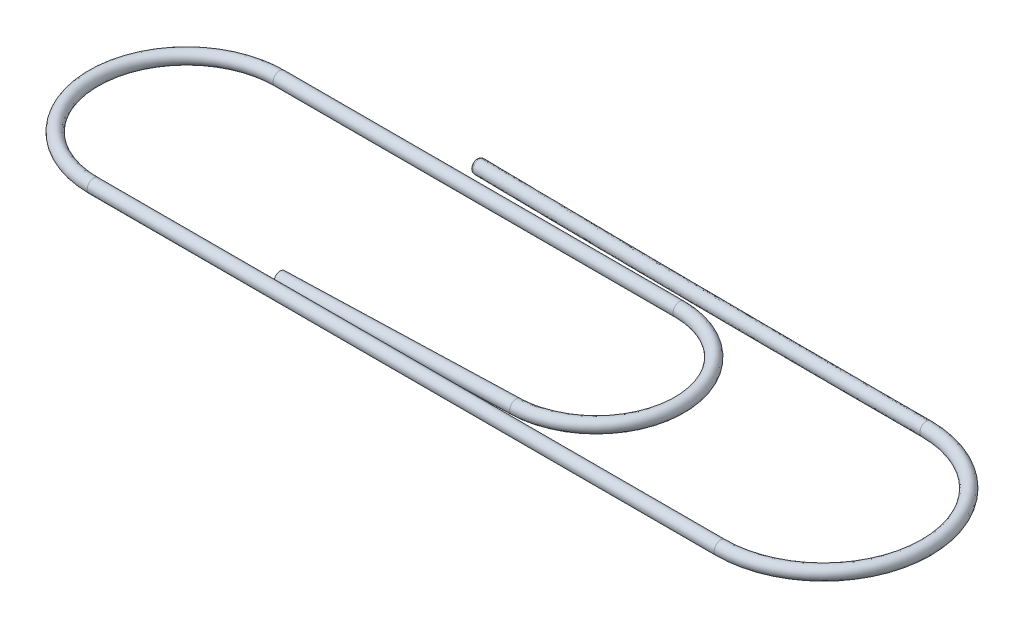
ISO-10303-21;
HEADER;
FILE_DESCRIPTION(('STEP AP214'),'2;1');
FILE_NAME('part.step','',(''),(''),'','','');
FILE_SCHEMA(('AUTOMOTIVE_DESIGN { 1 0 10303 214 1 1 1 1 }'));
ENDSEC;
DATA;
#1=APPLICATION_CONTEXT('core data for automotive mechanical design processes');
#2=APPLICATION_PROTOCOL_DEFINITION('international standard','automotive_design',2000,#1);
#3=PRODUCT_CONTEXT('',#1,'mechanical');
#4=PRODUCT('Part','Part','',(#3));
#5=PRODUCT_RELATED_PRODUCT_CATEGORY('part','',(#4));
#6=PRODUCT_DEFINITION_FORMATION('','',#4);
#7=PRODUCT_DEFINITION_CONTEXT('part definition',#1,'design');
#8=PRODUCT_DEFINITION('design','',#6,#7);
#9=PRODUCT_DEFINITION_SHAPE('','',#8);
#10=(LENGTH_UNIT() NAMED_UNIT(*) SI_UNIT(.MILLI.,.METRE.));
#11=(NAMED_UNIT(*) PLANE_ANGLE_UNIT() SI_UNIT($,.RADIAN.));
#12=(NAMED_UNIT(*) SI_UNIT($,.STERADIAN.) SOLID_ANGLE_UNIT());
#13=UNCERTAINTY_MEASURE_WITH_UNIT(LENGTH_MEASURE(1.E-05),#10,'distance_accuracy_value','');
#14=(GEOMETRIC_REPRESENTATION_CONTEXT(3) GLOBAL_UNCERTAINTY_ASSIGNED_CONTEXT((#13)) GLOBAL_UNIT_ASSIGNED_CONTEXT((#10,
#11,#12)) REPRESENTATION_CONTEXT('',''));
#15=CARTESIAN_POINT('',(0.,0.,0.));
#16=DIRECTION('',(0.,0.,1.));
#17=DIRECTION('',(1.,0.,0.));
#18=AXIS2_PLACEMENT_3D('',#15,#16,#17);
#19=CARTESIAN_POINT('',(19.1188837779093,0.,7.17392053449084));
#20=DIRECTION('',(-0.998871822194338,0.,0.0474877123702843));
#21=DIRECTION('',(0.0474877123702843,0.,0.998871822194338));
#22=AXIS2_PLACEMENT_3D('',#19,#20,#21);
#23=CIRCLE('',#22,0.25);
#24=DIRECTION('',(-0.999507468153765,0.,0.0313818594868043));
#25=VECTOR('',#24,1.);
#26=SURFACE_OF_LINEAR_EXTRUSION('',#23,#25);
#27=CARTESIAN_POINT('',(19.1307557060018,0.,7.42363849003943));
#28=VERTEX_POINT('',#27);
#29=EDGE_CURVE('E101',#28,#28,#23,.T.);
#30=ORIENTED_EDGE('',*,*,#29,.T.);
#31=EDGE_LOOP('',(#30));
#32=FACE_BOUND('',#31,.T.);
#33=CARTESIAN_POINT('',(10.2927008856981,0.,7.45103905551584));
#34=DIRECTION('',(-0.998871822194338,0.,0.0474877123702843));
#35=DIRECTION('',(0.0474877123702843,0.,0.998871822194338));
#36=AXIS2_PLACEMENT_3D('',#33,#34,#35);
#37=CIRCLE('',#36,0.25);
#38=CARTESIAN_POINT('',(10.3045728137906,0.,7.70075701106442));
#39=VERTEX_POINT('',#38);
#40=EDGE_CURVE('E63',#39,#39,#37,.T.);
#41=ORIENTED_EDGE('',*,*,#40,.F.);
#42=EDGE_LOOP('',(#41));
#43=FACE_BOUND('',#42,.T.);
#44=ADVANCED_FACE('F49',(#32,#43),#26,.T.);
#45=CARTESIAN_POINT('',(19.01825,0.,0.761999960988757));
#46=DIRECTION('',(0.999870098728555,0.,-0.0161178679902065));
#47=DIRECTION('',(-0.0161178679902065,0.,-0.999870098728555));
#48=AXIS2_PLACEMENT_3D('',#45,#46,#47);
#49=CIRCLE('',#48,0.25);
#50=CARTESIAN_POINT('',(19.01825,0.,3.96874996098875));
#51=DIRECTION('',(0.,-1.,0.));
#52=AXIS1_PLACEMENT('',#50,#51);
#53=SURFACE_OF_REVOLUTION('',#49,#52);
#54=CARTESIAN_POINT('',(19.0142205330025,0.,0.512032436306618));
#55=VERTEX_POINT('',#54);
#56=EDGE_CURVE('E104',#55,#55,#49,.T.);
#57=ORIENTED_EDGE('',*,*,#56,.T.);
#58=EDGE_LOOP('',(#57));
#59=FACE_BOUND('',#58,.T.);
#60=ORIENTED_EDGE('',*,*,#29,.F.);
#61=EDGE_LOOP('',(#60));
#62=FACE_BOUND('',#61,.T.);
#63=ADVANCED_FACE('F97',(#59,#62),#53,.F.);
#64=CARTESIAN_POINT('',(3.58775000000004,0.,0.761999960988757));
#65=DIRECTION('',(0.999870098728555,0.,-0.0161178679902065));
#66=DIRECTION('',(-0.0161178679902065,0.,-0.999870098728555));
#67=AXIS2_PLACEMENT_3D('',#64,#65,#66);
#68=CIRCLE('',#67,0.25);
#69=DIRECTION('',(1.,0.,0.));
#70=VECTOR('',#69,1.);
#71=SURFACE_OF_LINEAR_EXTRUSION('',#68,#70);
#72=CARTESIAN_POINT('',(3.58372053300249,0.,0.512032436306618));
#73=VERTEX_POINT('',#72);
#74=EDGE_CURVE('E133',#73,#73,#68,.T.);
#75=ORIENTED_EDGE('',*,*,#74,.T.);
#76=EDGE_LOOP('',(#75));
#77=FACE_BOUND('',#76,.T.);
#78=ORIENTED_EDGE('',*,*,#56,.F.);
#79=EDGE_LOOP('',(#78));
#80=FACE_BOUND('',#79,.T.);
#81=ADVANCED_FACE('F137',(#77,#80),#71,.T.);
#82=CARTESIAN_POINT('',(3.58775,0.,7.9375));
#83=DIRECTION('',(-0.999870098728555,0.,0.0161178679902206));
#84=DIRECTION('',(0.0161178679902206,0.,0.999870098728555));
#85=AXIS2_PLACEMENT_3D('',#82,#83,#84);
#86=CIRCLE('',#85,0.25);
#87=CARTESIAN_POINT('',(3.58775,0.,4.34974998049438));
#88=DIRECTION('',(0.,-1.,0.));
#89=AXIS1_PLACEMENT('',#87,#88);
#90=SURFACE_OF_REVOLUTION('',#86,#89);
#91=CARTESIAN_POINT('',(3.59177946699756,0.,8.18746752468213));
#92=VERTEX_POINT('',#91);
#93=EDGE_CURVE('E130',#92,#92,#86,.T.);
#94=ORIENTED_EDGE('',*,*,#93,.T.);
#95=EDGE_LOOP('',(#94));
#96=FACE_BOUND('',#95,.T.);
#97=ORIENTED_EDGE('',*,*,#74,.F.);
#98=EDGE_LOOP('',(#97));
#99=FACE_BOUND('',#98,.T.);
#100=ADVANCED_FACE('F135',(#96,#99),#90,.F.);
#101=CARTESIAN_POINT('',(27.78125,0.,7.9375));
#102=DIRECTION('',(-0.999870098728555,0.,0.0161178679902206));
#103=DIRECTION('',(0.0161178679902206,0.,0.999870098728555));
#104=AXIS2_PLACEMENT_3D('',#101,#102,#103);
#105=CIRCLE('',#104,0.25);
#106=DIRECTION('',(-1.,0.,0.));
#107=VECTOR('',#106,1.);
#108=SURFACE_OF_LINEAR_EXTRUSION('',#105,#107);
#109=CARTESIAN_POINT('',(27.7852794669976,0.,8.18746752468213));
#110=VERTEX_POINT('',#109);
#111=EDGE_CURVE('E126',#110,#110,#105,.T.);
#112=ORIENTED_EDGE('',*,*,#111,.T.);
#113=EDGE_LOOP('',(#112));
#114=FACE_BOUND('',#113,.T.);
#115=ORIENTED_EDGE('',*,*,#93,.F.);
#116=EDGE_LOOP('',(#115));
#117=FACE_BOUND('',#116,.T.);
#118=ADVANCED_FACE('F116',(#114,#117),#108,.T.);
#119=CARTESIAN_POINT('',(27.78125,0.,0.));
#120=DIRECTION('',(0.999870098728555,0.,-0.0161178679902205));
#121=DIRECTION('',(-0.0161178679902205,0.,-0.999870098728555));
#122=AXIS2_PLACEMENT_3D('',#119,#120,#121);
#123=CIRCLE('',#122,0.25);
#124=CARTESIAN_POINT('',(27.78125,0.,3.96875));
#125=DIRECTION('',(0.,-1.,0.));
#126=AXIS1_PLACEMENT('',#124,#125);
#127=SURFACE_OF_REVOLUTION('',#123,#126);
#128=CARTESIAN_POINT('',(27.7772205330024,0.,-0.249967524682136));
#129=VERTEX_POINT('',#128);
#130=EDGE_CURVE('E123',#129,#129,#123,.T.);
#131=ORIENTED_EDGE('',*,*,#130,.T.);
#132=EDGE_LOOP('',(#131));
#133=FACE_BOUND('',#132,.T.);
#134=ORIENTED_EDGE('',*,*,#111,.F.);
#135=EDGE_LOOP('',(#134));
#136=FACE_BOUND('',#135,.T.);
#137=ADVANCED_FACE('F112',(#133,#136),#127,.F.);
#138=CARTESIAN_POINT('',(10.2927008856981,0.,7.45103905551584));
#139=DIRECTION('',(-0.998871822194338,0.,0.0474877123702843));
#140=DIRECTION('',(0.0474877123702843,0.,0.998871822194338));
#141=AXIS2_PLACEMENT_3D('',#138,#139,#140);
#142=PLANE('',#141);
#143=ORIENTED_EDGE('',*,*,#40,.T.);
#144=EDGE_LOOP('',(#143));
#145=FACE_BOUND('',#144,.T.);
#146=ADVANCED_FACE('F80',(#145),#142,.T.);
#147=CARTESIAN_POINT('',(10.2927008856981,0.,-0.140952795368569));
#148=DIRECTION('',(1.,0.,0.));
#149=DIRECTION('',(0.,0.,-1.));
#150=AXIS2_PLACEMENT_3D('',#147,#148,#149);
#151=PLANE('',#150);
#152=CARTESIAN_POINT('',(10.3969523041302,0.0262704501718762,-0.387892734492162));
#153=CARTESIAN_POINT('',(10.2927008856981,0.0264450636215037,-0.389545228268651));
#154=CARTESIAN_POINT('',(10.2927008856981,0.015488764367717,-0.285857818341991));
#155=CARTESIAN_POINT('',(10.3969717341417,-0.0016854286938876,-0.390846429211876));
#156=CARTESIAN_POINT('',(10.2927008856981,-0.00169727399447617,-0.392538800053713));
#157=CARTESIAN_POINT('',(10.2927008856981,-0.000993669998707982,-0.287599461649409));
#158=CARTESIAN_POINT('',(10.396959850271,-0.0301440747797538,-0.389039834831399));
#159=CARTESIAN_POINT('',(10.2927008856981,-0.0303443382200909,-0.390707981657681));
#160=CARTESIAN_POINT('',(10.2927008856981,-0.0177727031108458,-0.286534175680925));
#161=CARTESIAN_POINT('',(10.3968747885958,-0.0848609054419516,-0.376109120874904));
#162=CARTESIAN_POINT('',(10.2927008856981,-0.0853968562846151,-0.377607746978989));
#163=CARTESIAN_POINT('',(10.2927008856981,-0.0500326930452836,-0.278909678599623));
#164=CARTESIAN_POINT('',(10.3968016095284,-0.111119044659755,-0.364984809286924));
#165=CARTESIAN_POINT('',(10.2927008856981,-0.111786518300365,-0.366346079300537));
#166=CARTESIAN_POINT('',(10.2927008856981,-0.065513623110096,-0.272350354270116));
#167=CARTESIAN_POINT('',(10.396602187425,-0.158473021607376,-0.334670983092438));
#168=CARTESIAN_POINT('',(10.2927008856981,-0.15929599848195,-0.335689396788024));
#169=CARTESIAN_POINT('',(10.2927008856981,-0.0934308225813917,-0.254477185662502));
#170=CARTESIAN_POINT('',(10.3964759464548,-0.179569060248643,-0.315481782454334));
#171=CARTESIAN_POINT('',(10.2927008856982,-0.180408799858799,-0.316310705656236));
#172=CARTESIAN_POINT('',(10.2927008856981,-0.105867210482936,-0.243163526471991));
#173=CARTESIAN_POINT('',(10.3961846308727,-0.214218333602795,-0.271201705468701));
#174=CARTESIAN_POINT('',(10.2927008856982,-0.214965926500342,-0.271666137039993));
#175=CARTESIAN_POINT('',(10.2927008856981,-0.126292624007528,-0.2170581176488));
#176=CARTESIAN_POINT('',(10.3960195594227,-0.227772182156553,-0.246111309641913));
#177=CARTESIAN_POINT('',(10.2927008856981,-0.228415306092628,-0.246417619461503));
#178=CARTESIAN_POINT('',(10.2927008856981,-0.134282011561349,-0.202266651205992));
#179=CARTESIAN_POINT('',(10.3956692161876,-0.245807728593336,-0.192859479992094));
#180=CARTESIAN_POINT('',(10.2927008856981,-0.246153793567999,-0.192939201212411));
#181=CARTESIAN_POINT('',(10.2927008856981,-0.144912997845978,-0.170874274972134));
#182=CARTESIAN_POINT('',(10.395483946185,-0.250290226316959,-0.164698317155994));
#183=CARTESIAN_POINT('',(10.2927008856981,-0.250457681372422,-0.164719840066544));
#184=CARTESIAN_POINT('',(10.2927008856981,-0.14755506806131,-0.15427352484557));
#185=CARTESIAN_POINT('',(10.3951141226355,-0.249680312778489,-0.108481521328791));
#186=CARTESIAN_POINT('',(10.2927008856981,-0.249478045950884,-0.108511020647321));
#187=CARTESIAN_POINT('',(10.2927008856981,-0.147195566821947,-0.12113419647553));
#188=CARTESIAN_POINT('',(10.3949295690489,-0.244588440342489,-0.0804258824880475));
#189=CARTESIAN_POINT('',(10.2927008856981,-0.244212296868704,-0.0805208069501533));
#190=CARTESIAN_POINT('',(10.2927008856981,-0.14419431296206,-0.104595614785827));
#191=CARTESIAN_POINT('',(10.3945819988989,-0.225401205936149,-0.0275836156925946));
#192=CARTESIAN_POINT('',(10.2927008856981,-0.224744648917407,-0.0279138388980587));
#193=CARTESIAN_POINT('',(10.2927008856981,-0.132884425730617,-0.0734445639407528));
#194=CARTESIAN_POINT('',(10.3944189823418,-0.211305841353664,-0.00279698868631244));
#195=CARTESIAN_POINT('',(10.2927008856981,-0.210555703204691,-0.00328581549743061));
#196=CARTESIAN_POINT('',(10.2927008856981,-0.124575790819251,-0.0588320953441981));
#197=CARTESIAN_POINT('',(10.3941328313867,-0.175720632556697,0.0407165506788043));
#198=CARTESIAN_POINT('',(10.2927008856981,-0.174900099872742,0.0398707656262153));
#199=CARTESIAN_POINT('',(10.2927008856981,-0.103598531757523,-0.0331784520615266));
#200=CARTESIAN_POINT('',(10.3940096992501,-0.154230369211584,0.059443119446796));
#201=CARTESIAN_POINT('',(10.2927008856981,-0.153436155972887,0.0584157470586851));
#202=CARTESIAN_POINT('',(10.2927008856981,-0.0909296604761665,-0.0221374798707488));
#203=CARTESIAN_POINT('',(10.3938172082932,-0.106208077394227,0.0887201068245053));
#204=CARTESIAN_POINT('',(10.2927008856981,-0.105582261547005,0.0873706025795121));
#205=CARTESIAN_POINT('',(10.2927008856981,-0.0626183105996271,-0.00487555205665561));
#206=CARTESIAN_POINT('',(10.3937478542165,-0.0796756044125718,0.0992698041636195));
#207=CARTESIAN_POINT('',(10.2927008856981,-0.0791840352488633,0.0977947822079913));
#208=CARTESIAN_POINT('',(10.2927008856981,-0.046975569835018,0.00134497836209877));
#209=CARTESIAN_POINT('',(10.3936850033904,-0.035078551593091,0.108830421698291));
#210=CARTESIAN_POINT('',(10.2927008856981,-0.0348535872747743,0.10723606155636));
#211=CARTESIAN_POINT('',(10.2927008856981,-0.0206819437563929,0.00698235174706465));
#212=CARTESIAN_POINT('',(10.3936728358593,-0.017558763691063,0.110681364231672));
#213=CARTESIAN_POINT('',(10.2927008856981,-0.0174451242954917,0.109063416728784));
#214=CARTESIAN_POINT('',(10.2927008856981,-0.0103524597004396,0.00807377064399157));
#215=CARTESIAN_POINT('',(10.3936730339963,0.0280539894290708,0.110651181701847));
#216=CARTESIAN_POINT('',(10.2927008856981,0.0278724516999232,0.109033503844387));
#217=CARTESIAN_POINT('',(10.2927008856981,0.0165403328116203,0.00805596153203637));
#218=CARTESIAN_POINT('',(10.3937044107357,0.056207472712031,0.105878039923366));
#219=CARTESIAN_POINT('',(10.2927008856981,0.0558520829031821,0.10432055881063));
#220=CARTESIAN_POINT('',(10.2927008856981,0.0331393157686358,0.00524143219577492));
#221=CARTESIAN_POINT('',(10.3938266814124,0.10929347293327,0.0872795126287625));
#222=CARTESIAN_POINT('',(10.2927008856981,0.108652776414543,0.0859477525398294));
#223=CARTESIAN_POINT('',(10.2927008856981,0.0644373161105604,-0.00572487428903804));
#224=CARTESIAN_POINT('',(10.3939175754353,0.134225985231271,0.0734541140717203));
#225=CARTESIAN_POINT('',(10.2927008856981,0.133487084820169,0.0722773672961903));
#226=CARTESIAN_POINT('',(10.2927008856981,0.0791363307582885,-0.0138766591265808));
#227=CARTESIAN_POINT('',(10.3941485290343,0.178123945988089,0.0383295833574404));
#228=CARTESIAN_POINT('',(10.2927008856981,0.177303120125889,0.03750693490466));
#229=CARTESIAN_POINT('',(10.2927008856981,0.105015366104844,-0.0345856844074731));
#230=CARTESIAN_POINT('',(10.39428858656,0.19708964322871,0.0170307628771745));
#231=CARTESIAN_POINT('',(10.2927008856981,0.196289001102744,0.016390659966705));
#232=CARTESIAN_POINT('',(10.2927008856981,0.11619553351933,-0.0471427411301862));
#233=CARTESIAN_POINT('',(10.3946021294827,0.226895524331031,-0.0306442730065121));
#234=CARTESIAN_POINT('',(10.2927008856981,0.226253304689127,-0.030956115609704));
#235=CARTESIAN_POINT('',(10.2927008856981,0.133765346787737,-0.0752489056493025));
#236=CARTESIAN_POINT('',(10.3947756119468,0.237736420707508,-0.0570200429253494));
#237=CARTESIAN_POINT('',(10.2927008856981,0.237225187140696,-0.0572016769303314));
#238=CARTESIAN_POINT('',(10.2927008856981,0.140155412715728,-0.0907977509266626));
#239=CARTESIAN_POINT('',(10.395136423201,0.25007501294817,-0.111871720366568));
#240=CARTESIAN_POINT('',(10.2927008856981,0.249895674854718,-0.111895828007082));
#241=CARTESIAN_POINT('',(10.2927008856981,0.147428243376015,-0.123132773648951));
#242=CARTESIAN_POINT('',(10.3953237508545,0.251573474926774,-0.140347455490206));
#243=CARTESIAN_POINT('',(10.2927008856981,0.251579654439389,-0.140351928359978));
#244=CARTESIAN_POINT('',(10.2927008856981,0.148311459690492,-0.139918849522136));
#245=CARTESIAN_POINT('',(10.3956911112149,0.245058783239639,-0.196187749684731));
#246=CARTESIAN_POINT('',(10.2927008856981,0.245426313679288,-0.196277661446145));
#247=CARTESIAN_POINT('',(10.2927008856981,0.144471491437581,-0.1728363511632));
#248=CARTESIAN_POINT('',(10.3958711442158,0.237046013321695,-0.223552353540143));
#249=CARTESIAN_POINT('',(10.2927008856981,0.237572477257234,-0.223743713333225));
#250=CARTESIAN_POINT('',(10.2927008856981,0.139748533061414,-0.188967803315897));
#251=CARTESIAN_POINT('',(10.3962036052684,0.212414798853602,-0.274085877115609));
#252=CARTESIAN_POINT('',(10.2927008856981,0.213172885314012,-0.274571732378907));
#253=CARTESIAN_POINT('',(10.2927008856981,0.125229405406834,-0.218758433061964));
#254=CARTESIAN_POINT('',(10.3963560327944,0.195796190451437,-0.297254716938514));
#255=CARTESIAN_POINT('',(10.2927008856981,0.196616022944013,-0.29792012180415));
#256=CARTESIAN_POINT('',(10.2927008856981,0.115433139534501,-0.232417563576552));
#257=CARTESIAN_POINT('',(10.3966161070518,0.155827489832692,-0.336786780535532));
#258=CARTESIAN_POINT('',(10.2927008856981,0.156645334239832,-0.337828457427231));
#259=CARTESIAN_POINT('',(10.2927008856981,0.0918711746066593,-0.255724563048305));
#260=CARTESIAN_POINT('',(10.3967237506431,0.132476925806098,-0.353149527107271));
#261=CARTESIAN_POINT('',(10.2927008856981,0.133231015564385,-0.35437043928002));
#262=CARTESIAN_POINT('',(10.2927008856981,0.0781051973333767,-0.265372150740168));
#263=CARTESIAN_POINT('',(10.3968821374404,0.0816755368800976,-0.377226152848039));
#264=CARTESIAN_POINT('',(10.2927008856981,0.0821930043836311,-0.378739669011466));
#265=CARTESIAN_POINT('',(10.2927008856981,0.0481547327462864,-0.279568249238815));
#266=CARTESIAN_POINT('',(10.3969328755001,0.0542243413908508,-0.384939249778431));
#267=CARTESIAN_POINT('',(10.2927008856981,0.0545799865218461,-0.386552445205686));
#268=CARTESIAN_POINT('',(10.2927008856981,0.0319700268426089,-0.284116298864404));
#269=CARTESIAN_POINT('',(10.3969523041302,0.0262704501718762,-0.387892734492162));
#270=CARTESIAN_POINT('',(10.2927008856981,0.0264450636215037,-0.389545228268651));
#271=CARTESIAN_POINT('',(10.2927008856981,0.015488764367717,-0.285857818341991));
#272=(BOUNDED_SURFACE() B_SPLINE_SURFACE(3,2,((#152,#153,#154),(#155,#156,#157),(#158,#159,
#160),(#161,#162,#163),(#164,#165,#166),(#167,#168,#169),(#170,#171,#172),(#173,#174,#175),
(#176,#177,#178),(#179,#180,#181),(#182,#183,#184),(#185,#186,#187),(#188,#189,#190),(#191,#192,
#193),(#194,#195,#196),(#197,#198,#199),(#200,#201,#202),(#203,#204,#205),(#206,#207,#208),
(#209,#210,#211),(#212,#213,#214),(#215,#216,#217),(#218,#219,#220),(#221,#222,#223),(#224,#225,
#226),(#227,#228,#229),(#230,#231,#232),(#233,#234,#235),(#236,#237,#238),(#239,#240,#241),
(#242,#243,#244),(#245,#246,#247),(#248,#249,#250),(#251,#252,#253),(#254,#255,#256),(#257,#258,
#259),(#260,#261,#262),(#263,#264,#265),(#266,#267,#268),(#269,#270,#271)),.UNSPECIFIED.,.T.,
.F.,.F.) B_SPLINE_SURFACE_WITH_KNOTS((4,2,2,2,2,2,2,2,2,2,2,2,2,2,2,2,2,2,2,4),(3,3),(0.,
0.0494907437020244,0.0989825072942586,0.148472344336645,0.197958152929829,0.247439598062236,
0.296918258562824,0.346396933418458,0.395878413105593,0.445364256989553,0.476340100134878,
0.525830826935047,0.575321625033021,0.624810359376367,0.674294753234028,0.723775089133693,
0.773253428727881,0.822732710406192,0.872215460689965,0.921702685628788),(0.,1.),
.UNSPECIFIED.) GEOMETRIC_REPRESENTATION_ITEM() RATIONAL_B_SPLINE_SURFACE(((1.,0.701449475922388,
1.),(1.,0.701381992441623,1.),(1.,0.701423283167805,1.),(1.,0.701718664624709,1.),(1.,
0.701972759740732,1.),(1.,0.702664527899045,1.),(1.,0.703102193794872,1.),(1.,0.704110880462645,
1.),(1.,0.704681890376668,1.),(1.,0.705892074768088,1.),(1.,0.706531243230567,1.),(1.,
0.707805323525767,1.),(1.,0.708440235596011,1.),(1.,0.709634497988814,1.),(1.,0.71019384828945,
1.),(1.,0.711174795348417,1.),(1.,0.711596384296022,1.),(1.,0.712255111439371,1.),(1.,
0.71249223336354,1.),(1.,0.712707097255472,1.),(1.,0.712748683463862,1.),(1.,0.712748013086571,
1.),(1.,0.712640784503083,1.),(1.,0.712222655740298,1.),(1.,0.711911755267586,1.),(1.,
0.711120953898269,1.),(1.,0.710641060049483,1.),(1.,0.709565331529854,1.),(1.,0.708969507031471,
1.),(1.,0.707728544614408,1.),(1.,0.707083410743672,1.),(1.,0.705816530899768,1.),(1.,
0.705194783984056,1.),(1.,0.704045283964723,1.),(1.,0.703517532651,1.),(1.,0.702616329440215,
1.),(1.,0.702242888362471,1.),(1.,0.701693192027778,1.),(1.,0.701516954605118,1.),(1.,
0.701449475922388,1.))) REPRESENTATION_ITEM('') SURFACE());
#273=CARTESIAN_POINT('',(10.2927008856981,0.015488764367717,-0.285857818341991));
#274=CARTESIAN_POINT('',(10.2927008856981,-0.000993669998707968,-0.287599461649409));
#275=CARTESIAN_POINT('',(10.2927008856981,-0.0177727031108458,-0.286534175680925));
#276=CARTESIAN_POINT('',(10.2927008856981,-0.0500326930452836,-0.278909678599623));
#277=CARTESIAN_POINT('',(10.2927008856981,-0.065513623110096,-0.272350354270116));
#278=CARTESIAN_POINT('',(10.2927008856981,-0.0934308225813917,-0.254477185662502));
#279=CARTESIAN_POINT('',(10.2927008856981,-0.105867210482936,-0.243163526471991));
#280=CARTESIAN_POINT('',(10.2927008856981,-0.126292624007528,-0.2170581176488));
#281=CARTESIAN_POINT('',(10.2927008856981,-0.134282011561349,-0.202266651205992));
#282=CARTESIAN_POINT('',(10.2927008856981,-0.144912997845978,-0.170874274972134));
#283=CARTESIAN_POINT('',(10.2927008856981,-0.14755506806131,-0.15427352484557));
#284=CARTESIAN_POINT('',(10.2927008856981,-0.147195566821947,-0.12113419647553));
#285=CARTESIAN_POINT('',(10.2927008856981,-0.14419431296206,-0.104595614785827));
#286=CARTESIAN_POINT('',(10.2927008856981,-0.132884425730617,-0.0734445639407528));
#287=CARTESIAN_POINT('',(10.2927008856981,-0.124575790819251,-0.0588320953441981));
#288=CARTESIAN_POINT('',(10.2927008856981,-0.103598531757523,-0.0331784520615266));
#289=CARTESIAN_POINT('',(10.2927008856981,-0.0909296604761665,-0.0221374798707487));
#290=CARTESIAN_POINT('',(10.2927008856981,-0.0626183105996271,-0.00487555205665561));
#291=CARTESIAN_POINT('',(10.2927008856981,-0.046975569835018,0.00134497836209877));
#292=CARTESIAN_POINT('',(10.2927008856981,-0.0206819437563929,0.00698235174706465));
#293=CARTESIAN_POINT('',(10.2927008856981,-0.0103524597004396,0.00807377064399157));
#294=CARTESIAN_POINT('',(10.2927008856981,0.0165403328116203,0.00805596153203637));
#295=CARTESIAN_POINT('',(10.2927008856981,0.0331393157686357,0.00524143219577493));
#296=CARTESIAN_POINT('',(10.2927008856981,0.0644373161105604,-0.00572487428903804));
#297=CARTESIAN_POINT('',(10.2927008856981,0.0791363307582885,-0.0138766591265808));
#298=CARTESIAN_POINT('',(10.2927008856981,0.105015366104844,-0.0345856844074731));
#299=CARTESIAN_POINT('',(10.2927008856981,0.11619553351933,-0.0471427411301862));
#300=CARTESIAN_POINT('',(10.2927008856981,0.133765346787737,-0.0752489056493025));
#301=CARTESIAN_POINT('',(10.2927008856981,0.140155412715728,-0.0907977509266626));
#302=CARTESIAN_POINT('',(10.2927008856981,0.147428243376015,-0.123132773648951));
#303=CARTESIAN_POINT('',(10.2927008856981,0.148311459690492,-0.139918849522136));
#304=CARTESIAN_POINT('',(10.2927008856981,0.14447149143758,-0.1728363511632));
#305=CARTESIAN_POINT('',(10.2927008856981,0.139748533061414,-0.188967803315897));
#306=CARTESIAN_POINT('',(10.2927008856981,0.125229405406834,-0.218758433061964));
#307=CARTESIAN_POINT('',(10.2927008856981,0.115433139534501,-0.232417563576552));
#308=CARTESIAN_POINT('',(10.2927008856981,0.0918711746066593,-0.255724563048305));
#309=CARTESIAN_POINT('',(10.2927008856981,0.0781051973333767,-0.265372150740168));
#310=CARTESIAN_POINT('',(10.2927008856981,0.0481547327462864,-0.279568249238815));
#311=CARTESIAN_POINT('',(10.2927008856981,0.0319700268426089,-0.284116298864404));
#312=CARTESIAN_POINT('',(10.2927008856981,0.015488764367717,-0.285857818341991));
#313=B_SPLINE_CURVE_WITH_KNOTS('',3,(#273,#274,#275,#276,#277,#278,#279,#280,#281,#282,#283,
#284,#285,#286,#287,#288,#289,#290,#291,#292,#293,#294,#295,#296,#297,#298,#299,#300,#301,#302,
#303,#304,#305,#306,#307,#308,#309,#310,#311,#312),.UNSPECIFIED.,.T.,.F.,(4,2,2,2,2,2,2,2,2,2,2,
2,2,2,2,2,2,2,2,4),(0.,0.0494907437020244,0.0989825072942586,0.148472344336645,
0.197958152929829,0.247439598062236,0.296918258562824,0.346396933418458,0.395878413105593,
0.445364256989553,0.476340100134878,0.525830826935047,0.575321625033021,0.624810359376367,
0.674294753234028,0.723775089133693,0.773253428727881,0.822732710406192,0.872215460689965,
0.921702685628788),.UNSPECIFIED.);
#314=CARTESIAN_POINT('',(10.2927008856981,0.015488764367717,-0.285857818341991));
#315=VERTEX_POINT('',#314);
#316=EDGE_CURVE('E11',#315,#315,#313,.T.);
#317=ORIENTED_EDGE('',*,*,#316,.T.);
#318=EDGE_LOOP('',(#317));
#319=FACE_BOUND('',#318,.T.);
#320=ADVANCED_FACE('F76',(#319),#151,.F.);
#321=CARTESIAN_POINT('',(10.2927008856981,0.,-0.390952795368569));
#322=CARTESIAN_POINT('',(13.5563718536331,0.,-0.338328721263918));
#323=CARTESIAN_POINT('',(19.3844617536194,0.,-0.270668348831556));
#324=CARTESIAN_POINT('',(25.2127410062276,0.,-0.249976003083497));
#325=CARTESIAN_POINT('',(27.7772205330024,0.,-0.249967524682136));
#326=CARTESIAN_POINT('',(10.2927008856981,0.5,-0.390952795368569));
#327=CARTESIAN_POINT('',(13.5563718536331,0.5,-0.338328721263918));
#328=CARTESIAN_POINT('',(19.3844617536194,0.5,-0.270668348831556));
#329=CARTESIAN_POINT('',(25.2127410062276,0.5,-0.249976003083497));
#330=CARTESIAN_POINT('',(27.7772205330024,0.5,-0.249967524682136));
#331=CARTESIAN_POINT('',(10.2927008856981,0.5,0.109047204631431));
#332=CARTESIAN_POINT('',(13.5578761964215,0.5,0.16166788440198));
#333=CARTESIAN_POINT('',(19.3886524228157,0.5,0.229322195523447));
#334=CARTESIAN_POINT('',(25.2196179704231,0.5,0.249976003083502));
#335=CARTESIAN_POINT('',(27.7852794669976,0.5,0.249967524682141));
#336=CARTESIAN_POINT('',(10.2927008856981,0.,0.109047204631431));
#337=CARTESIAN_POINT('',(13.5578761964215,0.,0.16166788440198));
#338=CARTESIAN_POINT('',(19.3886524228157,0.,0.229322195523447));
#339=CARTESIAN_POINT('',(25.2196179704231,0.,0.249976003083502));
#340=CARTESIAN_POINT('',(27.7852794669976,0.,0.249967524682141));
#341=CARTESIAN_POINT('',(10.2927008856981,-0.5,0.109047204631431));
#342=CARTESIAN_POINT('',(13.5578761964215,-0.5,0.16166788440198));
#343=CARTESIAN_POINT('',(19.3886524228157,-0.5,0.229322195523447));
#344=CARTESIAN_POINT('',(25.2196179704231,-0.5,0.249976003083502));
#345=CARTESIAN_POINT('',(27.7852794669976,-0.5,0.249967524682141));
#346=CARTESIAN_POINT('',(10.2927008856981,-0.5,-0.390952795368569));
#347=CARTESIAN_POINT('',(13.5563718536331,-0.5,-0.338328721263918));
#348=CARTESIAN_POINT('',(19.3844617536194,-0.5,-0.270668348831556));
#349=CARTESIAN_POINT('',(25.2127410062276,-0.5,-0.249976003083497));
#350=CARTESIAN_POINT('',(27.7772205330024,-0.5,-0.249967524682136));
#351=CARTESIAN_POINT('',(10.2927008856981,0.,-0.390952795368569));
#352=CARTESIAN_POINT('',(13.5563718536331,0.,-0.338328721263918));
#353=CARTESIAN_POINT('',(19.3844617536194,0.,-0.270668348831556));
#354=CARTESIAN_POINT('',(25.2127410062276,0.,-0.249976003083497));
#355=CARTESIAN_POINT('',(27.7772205330024,0.,-0.249967524682136));
#356=(BOUNDED_SURFACE() B_SPLINE_SURFACE(3,3,((#321,#322,#323,#324,#325),(#326,#327,#328,#329,
#330),(#331,#332,#333,#334,#335),(#336,#337,#338,#339,#340),(#341,#342,#343,#344,#345),(#346,
#347,#348,#349,#350),(#351,#352,#353,#354,#355)),.UNSPECIFIED.,.T.,.F.,
.F.) B_SPLINE_SURFACE_WITH_KNOTS((4,3,4),(4,1,4),(0.,0.5,1.),(0.,0.56,1.),
.UNSPECIFIED.) GEOMETRIC_REPRESENTATION_ITEM() RATIONAL_B_SPLINE_SURFACE(((1.,1.,1.,1.,1.),
(0.333333333333333,0.333333333333333,0.333333333333333,0.333333333333333,0.333333333333333),
(0.333333333333333,0.333333333333333,0.333333333333333,0.333333333333333,0.333333333333333),(1.,
1.,1.,1.,1.),(0.333333333333333,0.333333333333333,0.333333333333333,0.333333333333333,
0.333333333333333),(0.333333333333333,0.333333333333333,0.333333333333333,0.333333333333333,
0.333333333333333),(1.,1.,1.,1.,1.))) REPRESENTATION_ITEM('') SURFACE());
#357=CARTESIAN_POINT('',(10.3969523041302,0.0262704501718762,-0.387892734492162));
#358=CARTESIAN_POINT('',(10.3969328755001,0.0542243413908508,-0.384939249778431));
#359=CARTESIAN_POINT('',(10.3968821374404,0.0816755368800976,-0.377226152848039));
#360=CARTESIAN_POINT('',(10.3967237506431,0.132476925806098,-0.35314952710727));
#361=CARTESIAN_POINT('',(10.3966161070518,0.155827489832692,-0.336786780535532));
#362=CARTESIAN_POINT('',(10.3963560327944,0.195796190451437,-0.297254716938514));
#363=CARTESIAN_POINT('',(10.3962036052684,0.212414798853602,-0.274085877115609));
#364=CARTESIAN_POINT('',(10.3958711442158,0.237046013321695,-0.223552353540143));
#365=CARTESIAN_POINT('',(10.3956911112149,0.245058783239639,-0.196187749684731));
#366=CARTESIAN_POINT('',(10.3953237508545,0.251573474926774,-0.140347455490206));
#367=CARTESIAN_POINT('',(10.395136423201,0.25007501294817,-0.111871720366568));
#368=CARTESIAN_POINT('',(10.3947756119468,0.237736420707508,-0.0570200429253494));
#369=CARTESIAN_POINT('',(10.3946021294827,0.226895524331031,-0.0306442730065121));
#370=CARTESIAN_POINT('',(10.39428858656,0.19708964322871,0.0170307628771745));
#371=CARTESIAN_POINT('',(10.3941485290343,0.178123945988089,0.0383295833574403));
#372=CARTESIAN_POINT('',(10.3939175754353,0.13422598523127,0.0734541140717203));
#373=CARTESIAN_POINT('',(10.3938266814124,0.10929347293327,0.0872795126287625));
#374=CARTESIAN_POINT('',(10.3937044107357,0.0562074727120309,0.105878039923366));
#375=CARTESIAN_POINT('',(10.3936730339963,0.0280539894290708,0.110651181701847));
#376=CARTESIAN_POINT('',(10.3936728358593,-0.017558763691063,0.110681364231672));
#377=CARTESIAN_POINT('',(10.3936850033904,-0.035078551593091,0.108830421698291));
#378=CARTESIAN_POINT('',(10.3937478542165,-0.0796756044125718,0.0992698041636195));
#379=CARTESIAN_POINT('',(10.3938172082932,-0.106208077394227,0.0887201068245053));
#380=CARTESIAN_POINT('',(10.3940096992501,-0.154230369211584,0.059443119446796));
#381=CARTESIAN_POINT('',(10.3941328313867,-0.175720632556697,0.0407165506788043));
#382=CARTESIAN_POINT('',(10.3944189823418,-0.211305841353664,-0.00279698868631245));
#383=CARTESIAN_POINT('',(10.3945819988989,-0.225401205936149,-0.0275836156925946));
#384=CARTESIAN_POINT('',(10.3949295690489,-0.244588440342489,-0.0804258824880475));
#385=CARTESIAN_POINT('',(10.3951141226355,-0.249680312778489,-0.108481521328791));
#386=CARTESIAN_POINT('',(10.395483946185,-0.250290226316959,-0.164698317155994));
#387=CARTESIAN_POINT('',(10.3956692161876,-0.245807728593336,-0.192859479992094));
#388=CARTESIAN_POINT('',(10.3960195594227,-0.227772182156553,-0.246111309641913));
#389=CARTESIAN_POINT('',(10.3961846308727,-0.214218333602795,-0.271201705468701));
#390=CARTESIAN_POINT('',(10.3964759464548,-0.179569060248643,-0.315481782454334));
#391=CARTESIAN_POINT('',(10.396602187425,-0.158473021607376,-0.334670983092438));
#392=CARTESIAN_POINT('',(10.3968016095284,-0.111119044659755,-0.364984809286924));
#393=CARTESIAN_POINT('',(10.3968747885958,-0.0848609054419516,-0.376109120874904));
#394=CARTESIAN_POINT('',(10.396959850271,-0.0301440747797538,-0.389039834831399));
#395=CARTESIAN_POINT('',(10.3969717341417,-0.00168542869388759,-0.390846429211876));
#396=CARTESIAN_POINT('',(10.3969523041302,0.0262704501718762,-0.387892734492162));
#397=B_SPLINE_CURVE_WITH_KNOTS('',3,(#357,#358,#359,#360,#361,#362,#363,#364,#365,#366,#367,
#368,#369,#370,#371,#372,#373,#374,#375,#376,#377,#378,#379,#380,#381,#382,#383,#384,#385,#386,
#387,#388,#389,#390,#391,#392,#393,#394,#395,#396),.UNSPECIFIED.,.T.,.F.,(4,2,2,2,2,2,2,2,2,2,2,
2,2,2,2,2,2,2,2,4),(0.,0.0494872249388232,0.0989699752225961,0.148449256900907,
0.197927596495095,0.247407932394761,0.296892326252422,0.346381060595768,0.395871858693741,
0.44536258549391,0.476338428639235,0.525824272523195,0.57530575221033,0.624784427065964,
0.674263087566552,0.723744532698959,0.773230341292143,0.82272017833453,0.872211941926764,
0.921702685628788),.UNSPECIFIED.);
#398=CARTESIAN_POINT('',(10.3969523041302,0.0262704501718762,-0.387892734492162));
#399=VERTEX_POINT('',#398);
#400=EDGE_CURVE('E59',#399,#399,#397,.T.);
#401=ORIENTED_EDGE('',*,*,#400,.T.);
#402=EDGE_LOOP('',(#401));
#403=FACE_BOUND('',#402,.T.);
#404=ORIENTED_EDGE('',*,*,#130,.F.);
#405=EDGE_LOOP('',(#404));
#406=FACE_BOUND('',#405,.T.);
#407=ADVANCED_FACE('F79',(#403,#406),#356,.T.);
#408=CARTESIAN_POINT('',(10.3953168856981,0.015488764367717,-0.285857818341991));
#409=DIRECTION('',(0.,-0.994463600914442,-0.105081618070348));
#410=DIRECTION('',(-1.,0.,0.));
#411=AXIS2_PLACEMENT_3D('',#408,#409,#410);
#412=CIRCLE('',#411,0.102616);
#413=EDGE_CURVE('',#315,#399,#412,.T.);
#414=ORIENTED_EDGE('',*,*,#316,.F.);
#415=ORIENTED_EDGE('',*,*,#400,.F.);
#416=ORIENTED_EDGE('',*,*,#413,.T.);
#417=ORIENTED_EDGE('',*,*,#413,.F.);
#418=EDGE_LOOP('',(#414,#416,#415,#417));
#419=FACE_BOUND('',#418,.T.);
#420=ADVANCED_FACE('F86',(#419),#272,.T.);
#421=CLOSED_SHELL('',(#44,#63,#81,#100,#118,#137,#146,#320,#407,#420));
#422=MANIFOLD_SOLID_BREP('B2',#421);
#423=ADVANCED_BREP_SHAPE_REPRESENTATION('',(#18,#422),#14);
#424=SHAPE_DEFINITION_REPRESENTATION(#9,#423);
ENDSEC;
END-ISO-10303-21;
